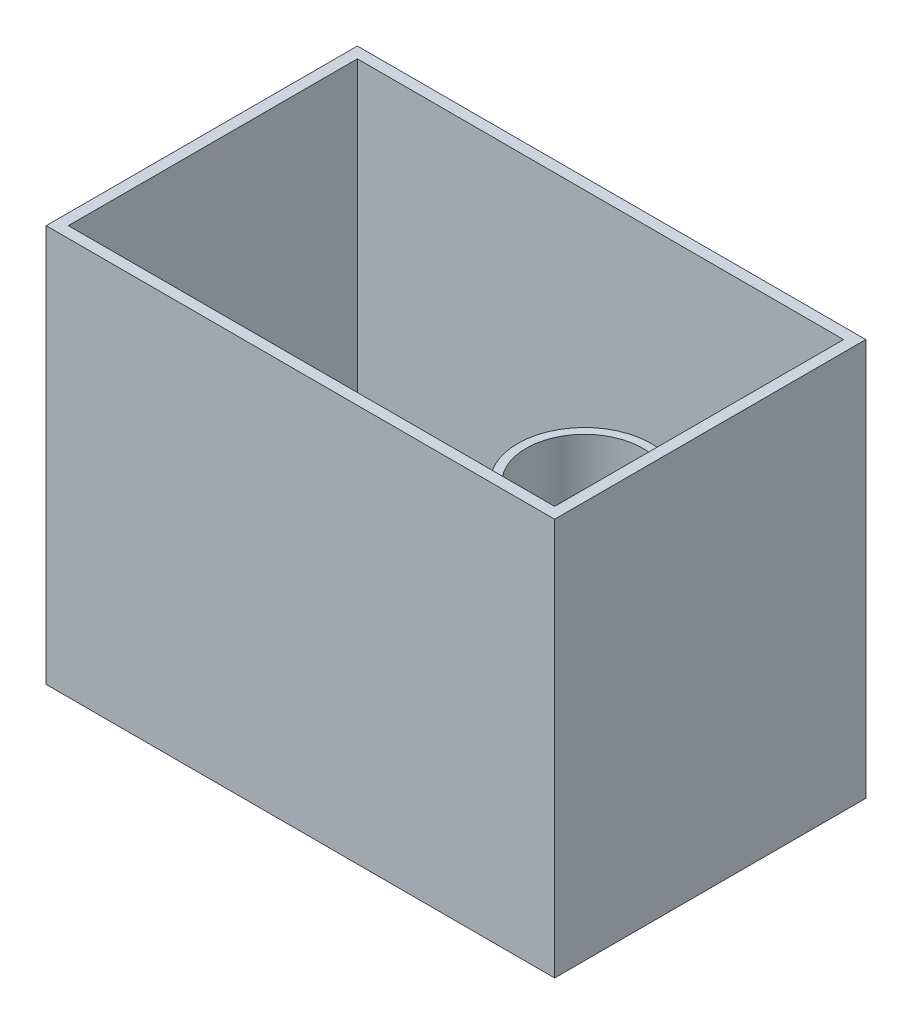
ISO-10303-21;
HEADER;
FILE_DESCRIPTION(('STEP AP214'),'2;1');
FILE_NAME('part.step','',(''),(''),'','','');
FILE_SCHEMA(('AUTOMOTIVE_DESIGN { 1 0 10303 214 1 1 1 1 }'));
ENDSEC;
DATA;
#1=APPLICATION_CONTEXT('core data for automotive mechanical design processes');
#2=APPLICATION_PROTOCOL_DEFINITION('international standard','automotive_design',2000,#1);
#3=PRODUCT_CONTEXT('',#1,'mechanical');
#4=PRODUCT('Part','Part','',(#3));
#5=PRODUCT_RELATED_PRODUCT_CATEGORY('part','',(#4));
#6=PRODUCT_DEFINITION_FORMATION('','',#4);
#7=PRODUCT_DEFINITION_CONTEXT('part definition',#1,'design');
#8=PRODUCT_DEFINITION('design','',#6,#7);
#9=PRODUCT_DEFINITION_SHAPE('','',#8);
#10=(LENGTH_UNIT() NAMED_UNIT(*) SI_UNIT(.MILLI.,.METRE.));
#11=(NAMED_UNIT(*) PLANE_ANGLE_UNIT() SI_UNIT($,.RADIAN.));
#12=(NAMED_UNIT(*) SI_UNIT($,.STERADIAN.) SOLID_ANGLE_UNIT());
#13=UNCERTAINTY_MEASURE_WITH_UNIT(LENGTH_MEASURE(1.E-05),#10,'distance_accuracy_value','');
#14=(GEOMETRIC_REPRESENTATION_CONTEXT(3) GLOBAL_UNCERTAINTY_ASSIGNED_CONTEXT((#13)) GLOBAL_UNIT_ASSIGNED_CONTEXT((#10,
#11,#12)) REPRESENTATION_CONTEXT('',''));
#15=CARTESIAN_POINT('',(0.,0.,0.));
#16=DIRECTION('',(0.,0.,1.));
#17=DIRECTION('',(1.,0.,0.));
#18=AXIS2_PLACEMENT_3D('',#15,#16,#17);
#19=CARTESIAN_POINT('',(0.,4.,0.));
#20=DIRECTION('',(0.,1.,0.));
#21=DIRECTION('',(0.,0.,1.));
#22=AXIS2_PLACEMENT_3D('',#19,#20,#21);
#23=PLANE('',#22);
#24=DIRECTION('',(-1.,0.,0.));
#25=VECTOR('',#24,1.);
#26=CARTESIAN_POINT('',(4.,4.,4.));
#27=LINE('',#26,#25);
#28=CARTESIAN_POINT('',(179.,4.,4.));
#29=VERTEX_POINT('',#28);
#30=CARTESIAN_POINT('',(4.,4.,4.));
#31=VERTEX_POINT('',#30);
#32=EDGE_CURVE('E49',#29,#31,#27,.T.);
#33=ORIENTED_EDGE('',*,*,#32,.T.);
#34=DIRECTION('',(0.,0.,1.));
#35=VECTOR('',#34,1.);
#36=CARTESIAN_POINT('',(4.,4.,4.));
#37=LINE('',#36,#35);
#38=CARTESIAN_POINT('',(4.00000000000001,4.,108.));
#39=VERTEX_POINT('',#38);
#40=EDGE_CURVE('E53',#31,#39,#37,.T.);
#41=ORIENTED_EDGE('',*,*,#40,.T.);
#42=DIRECTION('',(1.,0.,0.));
#43=VECTOR('',#42,1.);
#44=CARTESIAN_POINT('',(4.00000000000001,4.,108.));
#45=LINE('',#44,#43);
#46=CARTESIAN_POINT('',(179.,4.,108.));
#47=VERTEX_POINT('',#46);
#48=EDGE_CURVE('E129',#39,#47,#45,.T.);
#49=ORIENTED_EDGE('',*,*,#48,.T.);
#50=DIRECTION('',(0.,0.,-1.));
#51=VECTOR('',#50,1.);
#52=CARTESIAN_POINT('',(179.,4.,4.));
#53=LINE('',#52,#51);
#54=EDGE_CURVE('E108',#47,#29,#53,.T.);
#55=ORIENTED_EDGE('',*,*,#54,.T.);
#56=EDGE_LOOP('',(#33,#41,#49,#55));
#57=FACE_BOUND('',#56,.T.);
#58=CARTESIAN_POINT('',(61.,4.,56.));
#59=DIRECTION('',(0.,-1.,0.));
#60=DIRECTION('',(0.,0.,-1.));
#61=AXIS2_PLACEMENT_3D('',#58,#59,#60);
#62=CIRCLE('',#61,35.5);
#63=CARTESIAN_POINT('',(61.,4.,20.5));
#64=VERTEX_POINT('',#63);
#65=EDGE_CURVE('E127',#64,#64,#62,.T.);
#66=ORIENTED_EDGE('',*,*,#65,.T.);
#67=EDGE_LOOP('',(#66));
#68=FACE_BOUND('',#67,.T.);
#69=CARTESIAN_POINT('',(137.75,4.,56.));
#70=DIRECTION('',(0.,1.,0.));
#71=DIRECTION('',(0.,0.,1.));
#72=AXIS2_PLACEMENT_3D('',#69,#70,#71);
#73=CIRCLE('',#72,24.);
#74=CARTESIAN_POINT('',(137.75,4.,80.));
#75=VERTEX_POINT('',#74);
#76=EDGE_CURVE('E354',#75,#75,#73,.T.);
#77=ORIENTED_EDGE('',*,*,#76,.F.);
#78=EDGE_LOOP('',(#77));
#79=FACE_BOUND('',#78,.T.);
#80=ADVANCED_FACE('F33',(#57,#68,#79),#23,.T.);
#81=CARTESIAN_POINT('',(61.,4.,56.));
#82=DIRECTION('',(0.,-1.,0.));
#83=DIRECTION('',(0.,0.,-1.));
#84=AXIS2_PLACEMENT_3D('',#81,#82,#83);
#85=CYLINDRICAL_SURFACE('',#84,35.5);
#86=ORIENTED_EDGE('',*,*,#65,.F.);
#87=EDGE_LOOP('',(#86));
#88=FACE_BOUND('',#87,.T.);
#89=CARTESIAN_POINT('',(61.,2.,56.));
#90=DIRECTION('',(0.,-1.,0.));
#91=DIRECTION('',(0.,0.,-1.));
#92=AXIS2_PLACEMENT_3D('',#89,#90,#91);
#93=CIRCLE('',#92,35.5);
#94=CARTESIAN_POINT('',(61.,2.,20.5));
#95=VERTEX_POINT('',#94);
#96=EDGE_CURVE('E37',#95,#95,#93,.F.);
#97=ORIENTED_EDGE('',*,*,#96,.F.);
#98=EDGE_LOOP('',(#97));
#99=FACE_BOUND('',#98,.T.);
#100=ADVANCED_FACE('F187',(#88,#99),#85,.F.);
#101=CARTESIAN_POINT('',(0.,4.,0.));
#102=DIRECTION('',(1.,0.,0.));
#103=DIRECTION('',(0.,0.,-1.));
#104=AXIS2_PLACEMENT_3D('',#101,#102,#103);
#105=PLANE('',#104);
#106=DIRECTION('',(0.,0.,1.));
#107=VECTOR('',#106,1.);
#108=CARTESIAN_POINT('',(0.,0.,0.));
#109=LINE('',#108,#107);
#110=CARTESIAN_POINT('',(0.,0.,0.));
#111=VERTEX_POINT('',#110);
#112=CARTESIAN_POINT('',(0.,0.,112.));
#113=VERTEX_POINT('',#112);
#114=EDGE_CURVE('E148',#111,#113,#109,.T.);
#115=ORIENTED_EDGE('',*,*,#114,.T.);
#116=DIRECTION('',(0.,-1.,0.));
#117=VECTOR('',#116,1.);
#118=CARTESIAN_POINT('',(0.,4.,112.));
#119=LINE('',#118,#117);
#120=CARTESIAN_POINT('',(0.,143.,112.));
#121=VERTEX_POINT('',#120);
#122=EDGE_CURVE('E11',#121,#113,#119,.T.);
#123=ORIENTED_EDGE('',*,*,#122,.F.);
#124=DIRECTION('',(0.,0.,1.));
#125=VECTOR('',#124,1.);
#126=CARTESIAN_POINT('',(0.,143.,0.));
#127=LINE('',#126,#125);
#128=CARTESIAN_POINT('',(0.,143.,0.));
#129=VERTEX_POINT('',#128);
#130=EDGE_CURVE('E113',#129,#121,#127,.T.);
#131=ORIENTED_EDGE('',*,*,#130,.F.);
#132=DIRECTION('',(0.,-1.,0.));
#133=VECTOR('',#132,1.);
#134=CARTESIAN_POINT('',(0.,4.,0.));
#135=LINE('',#134,#133);
#136=EDGE_CURVE('E157',#129,#111,#135,.T.);
#137=ORIENTED_EDGE('',*,*,#136,.T.);
#138=EDGE_LOOP('',(#115,#123,#131,#137));
#139=FACE_BOUND('',#138,.T.);
#140=ADVANCED_FACE('F35',(#139),#105,.F.);
#141=CARTESIAN_POINT('',(0.,4.,112.));
#142=DIRECTION('',(0.,0.,-1.));
#143=DIRECTION('',(-1.,0.,0.));
#144=AXIS2_PLACEMENT_3D('',#141,#142,#143);
#145=PLANE('',#144);
#146=DIRECTION('',(1.,0.,0.));
#147=VECTOR('',#146,1.);
#148=CARTESIAN_POINT('',(0.,0.,112.));
#149=LINE('',#148,#147);
#150=CARTESIAN_POINT('',(183.,0.,112.));
#151=VERTEX_POINT('',#150);
#152=EDGE_CURVE('E151',#113,#151,#149,.T.);
#153=ORIENTED_EDGE('',*,*,#152,.T.);
#154=DIRECTION('',(0.,-1.,0.));
#155=VECTOR('',#154,1.);
#156=CARTESIAN_POINT('',(183.,4.,112.));
#157=LINE('',#156,#155);
#158=CARTESIAN_POINT('',(183.,143.,112.));
#159=VERTEX_POINT('',#158);
#160=EDGE_CURVE('E42',#159,#151,#157,.T.);
#161=ORIENTED_EDGE('',*,*,#160,.F.);
#162=DIRECTION('',(1.,0.,0.));
#163=VECTOR('',#162,1.);
#164=CARTESIAN_POINT('',(0.,143.,112.));
#165=LINE('',#164,#163);
#166=EDGE_CURVE('E139',#121,#159,#165,.T.);
#167=ORIENTED_EDGE('',*,*,#166,.F.);
#168=ORIENTED_EDGE('',*,*,#122,.T.);
#169=EDGE_LOOP('',(#153,#161,#167,#168));
#170=FACE_BOUND('',#169,.T.);
#171=ADVANCED_FACE('F180',(#170),#145,.F.);
#172=CARTESIAN_POINT('',(183.,4.,0.));
#173=DIRECTION('',(-1.,0.,0.));
#174=DIRECTION('',(0.,0.,1.));
#175=AXIS2_PLACEMENT_3D('',#172,#173,#174);
#176=PLANE('',#175);
#177=DIRECTION('',(0.,0.,-1.));
#178=VECTOR('',#177,1.);
#179=CARTESIAN_POINT('',(183.,0.,0.));
#180=LINE('',#179,#178);
#181=CARTESIAN_POINT('',(183.,0.,0.));
#182=VERTEX_POINT('',#181);
#183=EDGE_CURVE('E153',#151,#182,#180,.T.);
#184=ORIENTED_EDGE('',*,*,#183,.T.);
#185=DIRECTION('',(0.,-1.,0.));
#186=VECTOR('',#185,1.);
#187=CARTESIAN_POINT('',(183.,4.,0.));
#188=LINE('',#187,#186);
#189=CARTESIAN_POINT('',(183.,143.,0.));
#190=VERTEX_POINT('',#189);
#191=EDGE_CURVE('E160',#190,#182,#188,.T.);
#192=ORIENTED_EDGE('',*,*,#191,.F.);
#193=DIRECTION('',(0.,0.,-1.));
#194=VECTOR('',#193,1.);
#195=CARTESIAN_POINT('',(183.,143.,0.));
#196=LINE('',#195,#194);
#197=EDGE_CURVE('E142',#159,#190,#196,.T.);
#198=ORIENTED_EDGE('',*,*,#197,.F.);
#199=ORIENTED_EDGE('',*,*,#160,.T.);
#200=EDGE_LOOP('',(#184,#192,#198,#199));
#201=FACE_BOUND('',#200,.T.);
#202=ADVANCED_FACE('F167',(#201),#176,.F.);
#203=CARTESIAN_POINT('',(0.,4.,0.));
#204=DIRECTION('',(0.,0.,1.));
#205=DIRECTION('',(1.,0.,0.));
#206=AXIS2_PLACEMENT_3D('',#203,#204,#205);
#207=PLANE('',#206);
#208=DIRECTION('',(-1.,0.,0.));
#209=VECTOR('',#208,1.);
#210=CARTESIAN_POINT('',(0.,0.,0.));
#211=LINE('',#210,#209);
#212=EDGE_CURVE('E155',#182,#111,#211,.T.);
#213=ORIENTED_EDGE('',*,*,#212,.T.);
#214=ORIENTED_EDGE('',*,*,#136,.F.);
#215=DIRECTION('',(-1.,0.,0.));
#216=VECTOR('',#215,1.);
#217=CARTESIAN_POINT('',(0.,143.,0.));
#218=LINE('',#217,#216);
#219=EDGE_CURVE('E145',#190,#129,#218,.T.);
#220=ORIENTED_EDGE('',*,*,#219,.F.);
#221=ORIENTED_EDGE('',*,*,#191,.T.);
#222=EDGE_LOOP('',(#213,#214,#220,#221));
#223=FACE_BOUND('',#222,.T.);
#224=ADVANCED_FACE('F175',(#223),#207,.F.);
#225=CARTESIAN_POINT('',(0.,0.,0.));
#226=DIRECTION('',(0.,1.,0.));
#227=DIRECTION('',(0.,0.,1.));
#228=AXIS2_PLACEMENT_3D('',#225,#226,#227);
#229=PLANE('',#228);
#230=CARTESIAN_POINT('',(137.75,0.,56.));
#231=DIRECTION('',(0.,1.,0.));
#232=DIRECTION('',(0.,0.,1.));
#233=AXIS2_PLACEMENT_3D('',#230,#231,#232);
#234=CIRCLE('',#233,21.);
#235=CARTESIAN_POINT('',(137.75,0.,77.));
#236=VERTEX_POINT('',#235);
#237=EDGE_CURVE('E358',#236,#236,#234,.T.);
#238=ORIENTED_EDGE('',*,*,#237,.T.);
#239=EDGE_LOOP('',(#238));
#240=FACE_BOUND('',#239,.T.);
#241=CARTESIAN_POINT('',(61.,0.,56.));
#242=DIRECTION('',(0.,-1.,0.));
#243=DIRECTION('',(0.,0.,-1.));
#244=AXIS2_PLACEMENT_3D('',#241,#242,#243);
#245=CIRCLE('',#244,39.25);
#246=CARTESIAN_POINT('',(61.,0.,16.75));
#247=VERTEX_POINT('',#246);
#248=EDGE_CURVE('E365',#247,#247,#245,.T.);
#249=ORIENTED_EDGE('',*,*,#248,.F.);
#250=EDGE_LOOP('',(#249));
#251=FACE_BOUND('',#250,.T.);
#252=ORIENTED_EDGE('',*,*,#114,.F.);
#253=ORIENTED_EDGE('',*,*,#212,.F.);
#254=ORIENTED_EDGE('',*,*,#183,.F.);
#255=ORIENTED_EDGE('',*,*,#152,.F.);
#256=EDGE_LOOP('',(#252,#253,#254,#255));
#257=FACE_BOUND('',#256,.T.);
#258=ADVANCED_FACE('F173',(#240,#251,#257),#229,.F.);
#259=CARTESIAN_POINT('',(0.,143.,0.));
#260=DIRECTION('',(0.,1.,0.));
#261=DIRECTION('',(0.,0.,1.));
#262=AXIS2_PLACEMENT_3D('',#259,#260,#261);
#263=PLANE('',#262);
#264=ORIENTED_EDGE('',*,*,#130,.T.);
#265=ORIENTED_EDGE('',*,*,#166,.T.);
#266=ORIENTED_EDGE('',*,*,#197,.T.);
#267=ORIENTED_EDGE('',*,*,#219,.T.);
#268=EDGE_LOOP('',(#264,#265,#266,#267));
#269=FACE_BOUND('',#268,.T.);
#270=DIRECTION('',(0.,0.,1.));
#271=VECTOR('',#270,1.);
#272=CARTESIAN_POINT('',(4.,143.,4.));
#273=LINE('',#272,#271);
#274=CARTESIAN_POINT('',(4.,143.,4.));
#275=VERTEX_POINT('',#274);
#276=CARTESIAN_POINT('',(4.00000000000001,143.,108.));
#277=VERTEX_POINT('',#276);
#278=EDGE_CURVE('E107',#275,#277,#273,.T.);
#279=ORIENTED_EDGE('',*,*,#278,.F.);
#280=DIRECTION('',(-1.,0.,0.));
#281=VECTOR('',#280,1.);
#282=CARTESIAN_POINT('',(4.,143.,4.));
#283=LINE('',#282,#281);
#284=CARTESIAN_POINT('',(179.,143.,4.));
#285=VERTEX_POINT('',#284);
#286=EDGE_CURVE('E98',#285,#275,#283,.T.);
#287=ORIENTED_EDGE('',*,*,#286,.F.);
#288=DIRECTION('',(0.,0.,-1.));
#289=VECTOR('',#288,1.);
#290=CARTESIAN_POINT('',(179.,143.,4.));
#291=LINE('',#290,#289);
#292=CARTESIAN_POINT('',(179.,143.,108.));
#293=VERTEX_POINT('',#292);
#294=EDGE_CURVE('E121',#293,#285,#291,.T.);
#295=ORIENTED_EDGE('',*,*,#294,.F.);
#296=DIRECTION('',(1.,0.,0.));
#297=VECTOR('',#296,1.);
#298=CARTESIAN_POINT('',(4.00000000000001,143.,108.));
#299=LINE('',#298,#297);
#300=EDGE_CURVE('E119',#277,#293,#299,.T.);
#301=ORIENTED_EDGE('',*,*,#300,.F.);
#302=EDGE_LOOP('',(#279,#287,#295,#301));
#303=FACE_BOUND('',#302,.T.);
#304=ADVANCED_FACE('F117',(#269,#303),#263,.T.);
#305=CARTESIAN_POINT('',(4.,143.,4.));
#306=DIRECTION('',(0.,0.,1.));
#307=DIRECTION('',(1.,0.,0.));
#308=AXIS2_PLACEMENT_3D('',#305,#306,#307);
#309=PLANE('',#308);
#310=ORIENTED_EDGE('',*,*,#32,.F.);
#311=DIRECTION('',(0.,-1.,0.));
#312=VECTOR('',#311,1.);
#313=CARTESIAN_POINT('',(179.,143.,4.));
#314=LINE('',#313,#312);
#315=EDGE_CURVE('E103',#285,#29,#314,.T.);
#316=ORIENTED_EDGE('',*,*,#315,.F.);
#317=ORIENTED_EDGE('',*,*,#286,.T.);
#318=DIRECTION('',(0.,-1.,0.));
#319=VECTOR('',#318,1.);
#320=CARTESIAN_POINT('',(4.,143.,4.));
#321=LINE('',#320,#319);
#322=EDGE_CURVE('E101',#275,#31,#321,.T.);
#323=ORIENTED_EDGE('',*,*,#322,.T.);
#324=EDGE_LOOP('',(#310,#316,#317,#323));
#325=FACE_BOUND('',#324,.T.);
#326=ADVANCED_FACE('F100',(#325),#309,.T.);
#327=CARTESIAN_POINT('',(4.,143.,4.));
#328=DIRECTION('',(1.,0.,0.));
#329=DIRECTION('',(0.,0.,-1.));
#330=AXIS2_PLACEMENT_3D('',#327,#328,#329);
#331=PLANE('',#330);
#332=ORIENTED_EDGE('',*,*,#40,.F.);
#333=ORIENTED_EDGE('',*,*,#322,.F.);
#334=ORIENTED_EDGE('',*,*,#278,.T.);
#335=DIRECTION('',(0.,-1.,0.));
#336=VECTOR('',#335,1.);
#337=CARTESIAN_POINT('',(4.00000000000001,143.,108.));
#338=LINE('',#337,#336);
#339=EDGE_CURVE('E114',#277,#39,#338,.T.);
#340=ORIENTED_EDGE('',*,*,#339,.T.);
#341=EDGE_LOOP('',(#332,#333,#334,#340));
#342=FACE_BOUND('',#341,.T.);
#343=ADVANCED_FACE('F111',(#342),#331,.T.);
#344=CARTESIAN_POINT('',(4.00000000000001,143.,108.));
#345=DIRECTION('',(0.,0.,-1.));
#346=DIRECTION('',(-1.,0.,0.));
#347=AXIS2_PLACEMENT_3D('',#344,#345,#346);
#348=PLANE('',#347);
#349=ORIENTED_EDGE('',*,*,#48,.F.);
#350=ORIENTED_EDGE('',*,*,#339,.F.);
#351=ORIENTED_EDGE('',*,*,#300,.T.);
#352=DIRECTION('',(0.,-1.,0.));
#353=VECTOR('',#352,1.);
#354=CARTESIAN_POINT('',(179.,143.,108.));
#355=LINE('',#354,#353);
#356=EDGE_CURVE('E133',#293,#47,#355,.T.);
#357=ORIENTED_EDGE('',*,*,#356,.T.);
#358=EDGE_LOOP('',(#349,#350,#351,#357));
#359=FACE_BOUND('',#358,.T.);
#360=ADVANCED_FACE('F233',(#359),#348,.T.);
#361=CARTESIAN_POINT('',(179.,143.,4.));
#362=DIRECTION('',(-1.,0.,0.));
#363=DIRECTION('',(0.,0.,1.));
#364=AXIS2_PLACEMENT_3D('',#361,#362,#363);
#365=PLANE('',#364);
#366=ORIENTED_EDGE('',*,*,#54,.F.);
#367=ORIENTED_EDGE('',*,*,#356,.F.);
#368=ORIENTED_EDGE('',*,*,#294,.T.);
#369=ORIENTED_EDGE('',*,*,#315,.T.);
#370=EDGE_LOOP('',(#366,#367,#368,#369));
#371=FACE_BOUND('',#370,.T.);
#372=ADVANCED_FACE('F240',(#371),#365,.T.);
#373=CARTESIAN_POINT('',(61.,2.,56.));
#374=DIRECTION('',(0.,-1.,0.));
#375=DIRECTION('',(0.,0.,-1.));
#376=AXIS2_PLACEMENT_3D('',#373,#374,#375);
#377=PLANE('',#376);
#378=CARTESIAN_POINT('',(61.,2.,56.));
#379=DIRECTION('',(0.,-1.,0.));
#380=DIRECTION('',(0.,0.,-1.));
#381=AXIS2_PLACEMENT_3D('',#378,#379,#380);
#382=CIRCLE('',#381,39.25);
#383=CARTESIAN_POINT('',(61.,2.,16.75));
#384=VERTEX_POINT('',#383);
#385=EDGE_CURVE('E366',#384,#384,#382,.T.);
#386=ORIENTED_EDGE('',*,*,#385,.T.);
#387=EDGE_LOOP('',(#386));
#388=FACE_BOUND('',#387,.T.);
#389=ORIENTED_EDGE('',*,*,#96,.T.);
#390=EDGE_LOOP('',(#389));
#391=FACE_BOUND('',#390,.T.);
#392=ADVANCED_FACE('F248',(#388,#391),#377,.T.);
#393=CARTESIAN_POINT('',(61.,2.,56.));
#394=DIRECTION('',(0.,-1.,0.));
#395=DIRECTION('',(0.,0.,-1.));
#396=AXIS2_PLACEMENT_3D('',#393,#394,#395);
#397=CYLINDRICAL_SURFACE('',#396,39.25);
#398=ORIENTED_EDGE('',*,*,#385,.F.);
#399=EDGE_LOOP('',(#398));
#400=FACE_BOUND('',#399,.T.);
#401=ORIENTED_EDGE('',*,*,#248,.T.);
#402=EDGE_LOOP('',(#401));
#403=FACE_BOUND('',#402,.T.);
#404=ADVANCED_FACE('F266',(#400,#403),#397,.F.);
#405=CARTESIAN_POINT('',(137.75,0.,56.));
#406=DIRECTION('',(0.,1.,0.));
#407=DIRECTION('',(0.,0.,1.));
#408=AXIS2_PLACEMENT_3D('',#405,#406,#407);
#409=CYLINDRICAL_SURFACE('',#408,21.);
#410=ORIENTED_EDGE('',*,*,#237,.F.);
#411=EDGE_LOOP('',(#410));
#412=FACE_BOUND('',#411,.T.);
#413=CARTESIAN_POINT('',(137.75,104.,56.));
#414=DIRECTION('',(0.,1.,0.));
#415=DIRECTION('',(0.,0.,1.));
#416=AXIS2_PLACEMENT_3D('',#413,#414,#415);
#417=CIRCLE('',#416,21.);
#418=CARTESIAN_POINT('',(137.75,104.,77.));
#419=VERTEX_POINT('',#418);
#420=EDGE_CURVE('E356',#419,#419,#417,.T.);
#421=ORIENTED_EDGE('',*,*,#420,.T.);
#422=EDGE_LOOP('',(#421));
#423=FACE_BOUND('',#422,.T.);
#424=ADVANCED_FACE('F273',(#412,#423),#409,.F.);
#425=CARTESIAN_POINT('',(137.75,104.,56.));
#426=DIRECTION('',(0.,1.,0.));
#427=DIRECTION('',(0.,0.,1.));
#428=AXIS2_PLACEMENT_3D('',#425,#426,#427);
#429=PLANE('',#428);
#430=CARTESIAN_POINT('',(137.75,104.,56.));
#431=DIRECTION('',(0.,1.,0.));
#432=DIRECTION('',(0.,0.,1.));
#433=AXIS2_PLACEMENT_3D('',#430,#431,#432);
#434=CIRCLE('',#433,24.);
#435=CARTESIAN_POINT('',(137.75,104.,80.));
#436=VERTEX_POINT('',#435);
#437=EDGE_CURVE('E351',#436,#436,#434,.T.);
#438=ORIENTED_EDGE('',*,*,#437,.T.);
#439=EDGE_LOOP('',(#438));
#440=FACE_BOUND('',#439,.T.);
#441=ORIENTED_EDGE('',*,*,#420,.F.);
#442=EDGE_LOOP('',(#441));
#443=FACE_BOUND('',#442,.T.);
#444=ADVANCED_FACE('F280',(#440,#443),#429,.T.);
#445=CARTESIAN_POINT('',(137.75,104.,56.));
#446=DIRECTION('',(0.,-1.,0.));
#447=DIRECTION('',(0.,0.,-1.));
#448=AXIS2_PLACEMENT_3D('',#445,#446,#447);
#449=CYLINDRICAL_SURFACE('',#448,24.);
#450=ORIENTED_EDGE('',*,*,#437,.F.);
#451=EDGE_LOOP('',(#450));
#452=FACE_BOUND('',#451,.T.);
#453=ORIENTED_EDGE('',*,*,#76,.T.);
#454=EDGE_LOOP('',(#453));
#455=FACE_BOUND('',#454,.T.);
#456=ADVANCED_FACE('F287',(#452,#455),#449,.T.);
#457=CLOSED_SHELL('',(#80,#100,#140,#171,#202,#224,#258,#304,#326,#343,#360,#372,#392,#404,#424,
#444,#456));
#458=MANIFOLD_SOLID_BREP('B2',#457);
#459=ADVANCED_BREP_SHAPE_REPRESENTATION('',(#18,#458),#14);
#460=SHAPE_DEFINITION_REPRESENTATION(#9,#459);
ENDSEC;
END-ISO-10303-21;
